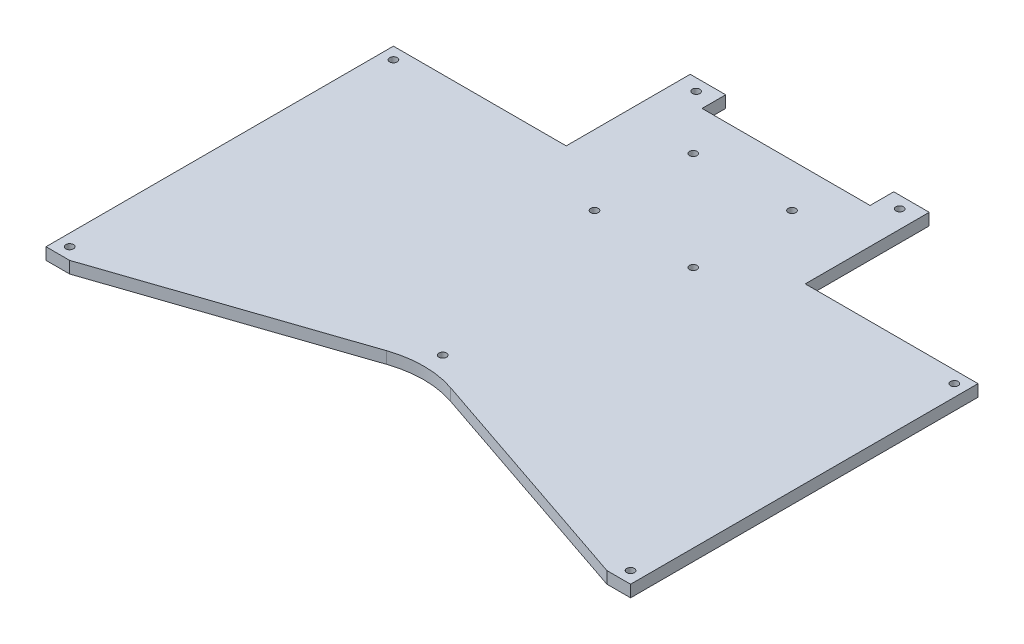
ISO-10303-21;
HEADER;
FILE_DESCRIPTION(('STEP AP214'),'2;1');
FILE_NAME('part.step','',(''),(''),'','','');
FILE_SCHEMA(('AUTOMOTIVE_DESIGN { 1 0 10303 214 1 1 1 1 }'));
ENDSEC;
DATA;
#1=APPLICATION_CONTEXT('core data for automotive mechanical design processes');
#2=APPLICATION_PROTOCOL_DEFINITION('international standard','automotive_design',2000,#1);
#3=PRODUCT_CONTEXT('',#1,'mechanical');
#4=PRODUCT('Part','Part','',(#3));
#5=PRODUCT_RELATED_PRODUCT_CATEGORY('part','',(#4));
#6=PRODUCT_DEFINITION_FORMATION('','',#4);
#7=PRODUCT_DEFINITION_CONTEXT('part definition',#1,'design');
#8=PRODUCT_DEFINITION('design','',#6,#7);
#9=PRODUCT_DEFINITION_SHAPE('','',#8);
#10=(LENGTH_UNIT() NAMED_UNIT(*) SI_UNIT(.MILLI.,.METRE.));
#11=(NAMED_UNIT(*) PLANE_ANGLE_UNIT() SI_UNIT($,.RADIAN.));
#12=(NAMED_UNIT(*) SI_UNIT($,.STERADIAN.) SOLID_ANGLE_UNIT());
#13=UNCERTAINTY_MEASURE_WITH_UNIT(LENGTH_MEASURE(1.E-05),#10,'distance_accuracy_value','');
#14=(GEOMETRIC_REPRESENTATION_CONTEXT(3) GLOBAL_UNCERTAINTY_ASSIGNED_CONTEXT((#13)) GLOBAL_UNIT_ASSIGNED_CONTEXT((#10,
#11,#12)) REPRESENTATION_CONTEXT('',''));
#15=CARTESIAN_POINT('',(0.,0.,0.));
#16=DIRECTION('',(0.,0.,1.));
#17=DIRECTION('',(1.,0.,0.));
#18=AXIS2_PLACEMENT_3D('',#15,#16,#17);
#19=CARTESIAN_POINT('',(35.5,5.,-21.2));
#20=DIRECTION('',(1.,0.,0.));
#21=DIRECTION('',(0.,0.,-1.));
#22=AXIS2_PLACEMENT_3D('',#19,#20,#21);
#23=PLANE('',#22);
#24=DIRECTION('',(0.,0.,1.));
#25=VECTOR('',#24,1.);
#26=CARTESIAN_POINT('',(35.5,0.,-21.2));
#27=LINE('',#26,#25);
#28=CARTESIAN_POINT('',(35.5,0.,-31.2));
#29=VERTEX_POINT('',#28);
#30=CARTESIAN_POINT('',(35.5,0.,-21.2));
#31=VERTEX_POINT('',#30);
#32=EDGE_CURVE('E177',#29,#31,#27,.T.);
#33=ORIENTED_EDGE('',*,*,#32,.T.);
#34=DIRECTION('',(0.,-1.,0.));
#35=VECTOR('',#34,1.);
#36=CARTESIAN_POINT('',(35.5,5.,-21.2));
#37=LINE('',#36,#35);
#38=CARTESIAN_POINT('',(35.5,5.,-21.2));
#39=VERTEX_POINT('',#38);
#40=EDGE_CURVE('E11',#39,#31,#37,.T.);
#41=ORIENTED_EDGE('',*,*,#40,.F.);
#42=DIRECTION('',(0.,0.,1.));
#43=VECTOR('',#42,1.);
#44=CARTESIAN_POINT('',(35.5,5.,-21.2));
#45=LINE('',#44,#43);
#46=CARTESIAN_POINT('',(35.5,5.,-31.2));
#47=VERTEX_POINT('',#46);
#48=EDGE_CURVE('E208',#47,#39,#45,.T.);
#49=ORIENTED_EDGE('',*,*,#48,.F.);
#50=DIRECTION('',(0.,-1.,0.));
#51=VECTOR('',#50,1.);
#52=CARTESIAN_POINT('',(35.5,5.,-31.2));
#53=LINE('',#52,#51);
#54=EDGE_CURVE('E173',#47,#29,#53,.T.);
#55=ORIENTED_EDGE('',*,*,#54,.T.);
#56=EDGE_LOOP('',(#33,#41,#49,#55));
#57=FACE_BOUND('',#56,.T.);
#58=ADVANCED_FACE('F33',(#57),#23,.F.);
#59=CARTESIAN_POINT('',(-35.5,5.,-21.2));
#60=DIRECTION('',(0.,0.,1.));
#61=DIRECTION('',(1.,0.,0.));
#62=AXIS2_PLACEMENT_3D('',#59,#60,#61);
#63=PLANE('',#62);
#64=DIRECTION('',(-1.,0.,0.));
#65=VECTOR('',#64,1.);
#66=CARTESIAN_POINT('',(-35.5,0.,-21.2));
#67=LINE('',#66,#65);
#68=CARTESIAN_POINT('',(-35.5,0.,-21.2));
#69=VERTEX_POINT('',#68);
#70=EDGE_CURVE('E180',#31,#69,#67,.T.);
#71=ORIENTED_EDGE('',*,*,#70,.T.);
#72=DIRECTION('',(0.,-1.,0.));
#73=VECTOR('',#72,1.);
#74=CARTESIAN_POINT('',(-35.5,5.,-21.2));
#75=LINE('',#74,#73);
#76=CARTESIAN_POINT('',(-35.5,5.,-21.2));
#77=VERTEX_POINT('',#76);
#78=EDGE_CURVE('E41',#77,#69,#75,.T.);
#79=ORIENTED_EDGE('',*,*,#78,.F.);
#80=DIRECTION('',(-1.,0.,0.));
#81=VECTOR('',#80,1.);
#82=CARTESIAN_POINT('',(-35.5,5.,-21.2));
#83=LINE('',#82,#81);
#84=EDGE_CURVE('E116',#39,#77,#83,.T.);
#85=ORIENTED_EDGE('',*,*,#84,.F.);
#86=ORIENTED_EDGE('',*,*,#40,.T.);
#87=EDGE_LOOP('',(#71,#79,#85,#86));
#88=FACE_BOUND('',#87,.T.);
#89=ADVANCED_FACE('F307',(#88),#63,.F.);
#90=CARTESIAN_POINT('',(-35.5,5.,-31.2));
#91=DIRECTION('',(-1.,0.,0.));
#92=DIRECTION('',(0.,0.,1.));
#93=AXIS2_PLACEMENT_3D('',#90,#91,#92);
#94=PLANE('',#93);
#95=DIRECTION('',(0.,0.,-1.));
#96=VECTOR('',#95,1.);
#97=CARTESIAN_POINT('',(-35.5,0.,-31.2));
#98=LINE('',#97,#96);
#99=CARTESIAN_POINT('',(-35.5,0.,-31.2));
#100=VERTEX_POINT('',#99);
#101=EDGE_CURVE('E183',#69,#100,#98,.T.);
#102=ORIENTED_EDGE('',*,*,#101,.T.);
#103=DIRECTION('',(0.,-1.,0.));
#104=VECTOR('',#103,1.);
#105=CARTESIAN_POINT('',(-35.5,5.,-31.2));
#106=LINE('',#105,#104);
#107=CARTESIAN_POINT('',(-35.5,5.,-31.2));
#108=VERTEX_POINT('',#107);
#109=EDGE_CURVE('E239',#108,#100,#106,.T.);
#110=ORIENTED_EDGE('',*,*,#109,.F.);
#111=DIRECTION('',(0.,0.,-1.));
#112=VECTOR('',#111,1.);
#113=CARTESIAN_POINT('',(-35.5,5.,-31.2));
#114=LINE('',#113,#112);
#115=EDGE_CURVE('E247',#77,#108,#114,.T.);
#116=ORIENTED_EDGE('',*,*,#115,.F.);
#117=ORIENTED_EDGE('',*,*,#78,.T.);
#118=EDGE_LOOP('',(#102,#110,#116,#117));
#119=FACE_BOUND('',#118,.T.);
#120=ADVANCED_FACE('F245',(#119),#94,.F.);
#121=CARTESIAN_POINT('',(-50.5,5.,-31.2));
#122=DIRECTION('',(0.,0.,1.));
#123=DIRECTION('',(1.,0.,0.));
#124=AXIS2_PLACEMENT_3D('',#121,#122,#123);
#125=PLANE('',#124);
#126=DIRECTION('',(-1.,0.,0.));
#127=VECTOR('',#126,1.);
#128=CARTESIAN_POINT('',(-50.5,0.,-31.2));
#129=LINE('',#128,#127);
#130=CARTESIAN_POINT('',(-50.5,0.,-31.2));
#131=VERTEX_POINT('',#130);
#132=EDGE_CURVE('E185',#100,#131,#129,.T.);
#133=ORIENTED_EDGE('',*,*,#132,.T.);
#134=DIRECTION('',(0.,-1.,0.));
#135=VECTOR('',#134,1.);
#136=CARTESIAN_POINT('',(-50.5,5.,-31.2));
#137=LINE('',#136,#135);
#138=CARTESIAN_POINT('',(-50.5,5.,-31.2));
#139=VERTEX_POINT('',#138);
#140=EDGE_CURVE('E236',#139,#131,#137,.T.);
#141=ORIENTED_EDGE('',*,*,#140,.F.);
#142=DIRECTION('',(-1.,0.,0.));
#143=VECTOR('',#142,1.);
#144=CARTESIAN_POINT('',(-50.5,5.,-31.2));
#145=LINE('',#144,#143);
#146=EDGE_CURVE('E265',#108,#139,#145,.T.);
#147=ORIENTED_EDGE('',*,*,#146,.F.);
#148=ORIENTED_EDGE('',*,*,#109,.T.);
#149=EDGE_LOOP('',(#133,#141,#147,#148));
#150=FACE_BOUND('',#149,.T.);
#151=ADVANCED_FACE('F256',(#150),#125,.F.);
#152=CARTESIAN_POINT('',(-50.5,5.,21.2));
#153=DIRECTION('',(1.,0.,0.));
#154=DIRECTION('',(0.,0.,-1.));
#155=AXIS2_PLACEMENT_3D('',#152,#153,#154);
#156=PLANE('',#155);
#157=DIRECTION('',(0.,0.,1.));
#158=VECTOR('',#157,1.);
#159=CARTESIAN_POINT('',(-50.5,0.,21.2));
#160=LINE('',#159,#158);
#161=CARTESIAN_POINT('',(-50.5,0.,21.2));
#162=VERTEX_POINT('',#161);
#163=EDGE_CURVE('E187',#131,#162,#160,.T.);
#164=ORIENTED_EDGE('',*,*,#163,.T.);
#165=DIRECTION('',(0.,-1.,0.));
#166=VECTOR('',#165,1.);
#167=CARTESIAN_POINT('',(-50.5,5.,21.2));
#168=LINE('',#167,#166);
#169=CARTESIAN_POINT('',(-50.5,5.,21.2));
#170=VERTEX_POINT('',#169);
#171=EDGE_CURVE('E233',#170,#162,#168,.T.);
#172=ORIENTED_EDGE('',*,*,#171,.F.);
#173=DIRECTION('',(0.,0.,1.));
#174=VECTOR('',#173,1.);
#175=CARTESIAN_POINT('',(-50.5,5.,21.2));
#176=LINE('',#175,#174);
#177=EDGE_CURVE('E262',#139,#170,#176,.T.);
#178=ORIENTED_EDGE('',*,*,#177,.F.);
#179=ORIENTED_EDGE('',*,*,#140,.T.);
#180=EDGE_LOOP('',(#164,#172,#178,#179));
#181=FACE_BOUND('',#180,.T.);
#182=ADVANCED_FACE('F260',(#181),#156,.F.);
#183=CARTESIAN_POINT('',(-123.5,5.,21.2));
#184=DIRECTION('',(0.,0.,1.));
#185=DIRECTION('',(1.,0.,0.));
#186=AXIS2_PLACEMENT_3D('',#183,#184,#185);
#187=PLANE('',#186);
#188=DIRECTION('',(-1.,0.,0.));
#189=VECTOR('',#188,1.);
#190=CARTESIAN_POINT('',(-123.5,0.,21.2));
#191=LINE('',#190,#189);
#192=CARTESIAN_POINT('',(-123.5,0.,21.2));
#193=VERTEX_POINT('',#192);
#194=EDGE_CURVE('E189',#162,#193,#191,.T.);
#195=ORIENTED_EDGE('',*,*,#194,.T.);
#196=DIRECTION('',(0.,-1.,0.));
#197=VECTOR('',#196,1.);
#198=CARTESIAN_POINT('',(-123.5,5.,21.2));
#199=LINE('',#198,#197);
#200=CARTESIAN_POINT('',(-123.5,5.,21.2));
#201=VERTEX_POINT('',#200);
#202=EDGE_CURVE('E230',#201,#193,#199,.T.);
#203=ORIENTED_EDGE('',*,*,#202,.F.);
#204=DIRECTION('',(-1.,0.,0.));
#205=VECTOR('',#204,1.);
#206=CARTESIAN_POINT('',(-123.5,5.,21.2));
#207=LINE('',#206,#205);
#208=EDGE_CURVE('E264',#170,#201,#207,.T.);
#209=ORIENTED_EDGE('',*,*,#208,.F.);
#210=ORIENTED_EDGE('',*,*,#171,.T.);
#211=EDGE_LOOP('',(#195,#203,#209,#210));
#212=FACE_BOUND('',#211,.T.);
#213=ADVANCED_FACE('F320',(#212),#187,.F.);
#214=CARTESIAN_POINT('',(-123.5,5.,168.));
#215=DIRECTION('',(1.,0.,0.));
#216=DIRECTION('',(0.,0.,-1.));
#217=AXIS2_PLACEMENT_3D('',#214,#215,#216);
#218=PLANE('',#217);
#219=DIRECTION('',(0.,0.,1.));
#220=VECTOR('',#219,1.);
#221=CARTESIAN_POINT('',(-123.5,0.,168.));
#222=LINE('',#221,#220);
#223=CARTESIAN_POINT('',(-123.5,0.,168.));
#224=VERTEX_POINT('',#223);
#225=EDGE_CURVE('E191',#193,#224,#222,.T.);
#226=ORIENTED_EDGE('',*,*,#225,.T.);
#227=DIRECTION('',(0.,-1.,0.));
#228=VECTOR('',#227,1.);
#229=CARTESIAN_POINT('',(-123.5,5.,168.));
#230=LINE('',#229,#228);
#231=CARTESIAN_POINT('',(-123.5,5.,168.));
#232=VERTEX_POINT('',#231);
#233=EDGE_CURVE('E227',#232,#224,#230,.T.);
#234=ORIENTED_EDGE('',*,*,#233,.F.);
#235=DIRECTION('',(0.,0.,1.));
#236=VECTOR('',#235,1.);
#237=CARTESIAN_POINT('',(-123.5,5.,168.));
#238=LINE('',#237,#236);
#239=EDGE_CURVE('E267',#201,#232,#238,.T.);
#240=ORIENTED_EDGE('',*,*,#239,.F.);
#241=ORIENTED_EDGE('',*,*,#202,.T.);
#242=EDGE_LOOP('',(#226,#234,#240,#241));
#243=FACE_BOUND('',#242,.T.);
#244=ADVANCED_FACE('F323',(#243),#218,.F.);
#245=CARTESIAN_POINT('',(-113.5,5.,168.));
#246=DIRECTION('',(0.,0.,-1.));
#247=DIRECTION('',(-1.,0.,0.));
#248=AXIS2_PLACEMENT_3D('',#245,#246,#247);
#249=PLANE('',#248);
#250=DIRECTION('',(1.,0.,0.));
#251=VECTOR('',#250,1.);
#252=CARTESIAN_POINT('',(-113.5,0.,168.));
#253=LINE('',#252,#251);
#254=CARTESIAN_POINT('',(-113.5,0.,168.));
#255=VERTEX_POINT('',#254);
#256=EDGE_CURVE('E193',#224,#255,#253,.T.);
#257=ORIENTED_EDGE('',*,*,#256,.T.);
#258=DIRECTION('',(0.,-1.,0.));
#259=VECTOR('',#258,1.);
#260=CARTESIAN_POINT('',(-113.5,5.,168.));
#261=LINE('',#260,#259);
#262=CARTESIAN_POINT('',(-113.5,5.,168.));
#263=VERTEX_POINT('',#262);
#264=EDGE_CURVE('E224',#263,#255,#261,.T.);
#265=ORIENTED_EDGE('',*,*,#264,.F.);
#266=DIRECTION('',(1.,0.,0.));
#267=VECTOR('',#266,1.);
#268=CARTESIAN_POINT('',(-113.5,5.,168.));
#269=LINE('',#268,#267);
#270=EDGE_CURVE('E273',#232,#263,#269,.T.);
#271=ORIENTED_EDGE('',*,*,#270,.F.);
#272=ORIENTED_EDGE('',*,*,#233,.T.);
#273=EDGE_LOOP('',(#257,#265,#271,#272));
#274=FACE_BOUND('',#273,.T.);
#275=ADVANCED_FACE('F327',(#274),#249,.F.);
#276=CARTESIAN_POINT('',(-113.5,5.,168.));
#277=DIRECTION('',(-0.321149003928869,0.,-0.947028678169513));
#278=DIRECTION('',(-0.947028678169513,0.,0.321149003928869));
#279=AXIS2_PLACEMENT_3D('',#276,#277,#278);
#280=PLANE('',#279);
#281=DIRECTION('',(0.947028678169513,0.,-0.321149003928869));
#282=VECTOR('',#281,1.);
#283=CARTESIAN_POINT('',(-113.5,0.,168.));
#284=LINE('',#283,#282);
#285=CARTESIAN_POINT('',(-13.4882581650125,0.,134.08479551688));
#286=VERTEX_POINT('',#285);
#287=EDGE_CURVE('E195',#255,#286,#284,.T.);
#288=ORIENTED_EDGE('',*,*,#287,.T.);
#289=DIRECTION('',(0.,-1.,0.));
#290=VECTOR('',#289,1.);
#291=CARTESIAN_POINT('',(-13.4882581650125,5.,134.08479551688));
#292=LINE('',#291,#290);
#293=CARTESIAN_POINT('',(-13.4882581650125,5.,134.08479551688));
#294=VERTEX_POINT('',#293);
#295=EDGE_CURVE('E221',#294,#286,#292,.T.);
#296=ORIENTED_EDGE('',*,*,#295,.F.);
#297=DIRECTION('',(0.947028678169513,0.,-0.321149003928869));
#298=VECTOR('',#297,1.);
#299=CARTESIAN_POINT('',(-113.5,5.,168.));
#300=LINE('',#299,#298);
#301=EDGE_CURVE('E275',#263,#294,#300,.T.);
#302=ORIENTED_EDGE('',*,*,#301,.F.);
#303=ORIENTED_EDGE('',*,*,#264,.T.);
#304=EDGE_LOOP('',(#288,#296,#302,#303));
#305=FACE_BOUND('',#304,.T.);
#306=ADVANCED_FACE('F331',(#305),#280,.F.);
#307=CARTESIAN_POINT('',(0.,5.,173.86));
#308=DIRECTION('',(0.,-1.,0.));
#309=DIRECTION('',(0.,0.,-1.));
#310=AXIS2_PLACEMENT_3D('',#307,#308,#309);
#311=CYLINDRICAL_SURFACE('',#310,42.);
#312=CARTESIAN_POINT('',(0.,0.,173.86));
#313=DIRECTION('',(0.,-1.,0.));
#314=DIRECTION('',(0.,0.,-1.));
#315=AXIS2_PLACEMENT_3D('',#312,#313,#314);
#316=CIRCLE('',#315,42.);
#317=CARTESIAN_POINT('',(13.4882581650125,0.,134.08479551688));
#318=VERTEX_POINT('',#317);
#319=EDGE_CURVE('E197',#286,#318,#316,.T.);
#320=ORIENTED_EDGE('',*,*,#319,.T.);
#321=DIRECTION('',(0.,-1.,0.));
#322=VECTOR('',#321,1.);
#323=CARTESIAN_POINT('',(13.4882581650125,5.,134.08479551688));
#324=LINE('',#323,#322);
#325=CARTESIAN_POINT('',(13.4882581650125,5.,134.08479551688));
#326=VERTEX_POINT('',#325);
#327=EDGE_CURVE('E218',#326,#318,#324,.T.);
#328=ORIENTED_EDGE('',*,*,#327,.F.);
#329=CARTESIAN_POINT('',(0.,5.,173.86));
#330=DIRECTION('',(0.,-1.,0.));
#331=DIRECTION('',(0.,0.,-1.));
#332=AXIS2_PLACEMENT_3D('',#329,#330,#331);
#333=CIRCLE('',#332,42.);
#334=EDGE_CURVE('E277',#294,#326,#333,.T.);
#335=ORIENTED_EDGE('',*,*,#334,.F.);
#336=ORIENTED_EDGE('',*,*,#295,.T.);
#337=EDGE_LOOP('',(#320,#328,#335,#336));
#338=FACE_BOUND('',#337,.T.);
#339=ADVANCED_FACE('F335',(#338),#311,.F.);
#340=CARTESIAN_POINT('',(13.4882581650125,5.,134.08479551688));
#341=DIRECTION('',(0.32114900392887,0.,-0.947028678169513));
#342=DIRECTION('',(-0.947028678169513,0.,-0.32114900392887));
#343=AXIS2_PLACEMENT_3D('',#340,#341,#342);
#344=PLANE('',#343);
#345=DIRECTION('',(0.947028678169513,0.,0.32114900392887));
#346=VECTOR('',#345,1.);
#347=CARTESIAN_POINT('',(13.4882581650125,0.,134.08479551688));
#348=LINE('',#347,#346);
#349=CARTESIAN_POINT('',(113.5,0.,168.));
#350=VERTEX_POINT('',#349);
#351=EDGE_CURVE('E199',#318,#350,#348,.T.);
#352=ORIENTED_EDGE('',*,*,#351,.T.);
#353=DIRECTION('',(0.,-1.,0.));
#354=VECTOR('',#353,1.);
#355=CARTESIAN_POINT('',(113.5,5.,168.));
#356=LINE('',#355,#354);
#357=CARTESIAN_POINT('',(113.5,5.,168.));
#358=VERTEX_POINT('',#357);
#359=EDGE_CURVE('E215',#358,#350,#356,.T.);
#360=ORIENTED_EDGE('',*,*,#359,.F.);
#361=DIRECTION('',(0.947028678169513,0.,0.32114900392887));
#362=VECTOR('',#361,1.);
#363=CARTESIAN_POINT('',(13.4882581650125,5.,134.08479551688));
#364=LINE('',#363,#362);
#365=EDGE_CURVE('E279',#326,#358,#364,.T.);
#366=ORIENTED_EDGE('',*,*,#365,.F.);
#367=ORIENTED_EDGE('',*,*,#327,.T.);
#368=EDGE_LOOP('',(#352,#360,#366,#367));
#369=FACE_BOUND('',#368,.T.);
#370=ADVANCED_FACE('F339',(#369),#344,.F.);
#371=CARTESIAN_POINT('',(123.5,5.,168.));
#372=DIRECTION('',(0.,0.,-1.));
#373=DIRECTION('',(-1.,0.,0.));
#374=AXIS2_PLACEMENT_3D('',#371,#372,#373);
#375=PLANE('',#374);
#376=DIRECTION('',(1.,0.,0.));
#377=VECTOR('',#376,1.);
#378=CARTESIAN_POINT('',(123.5,0.,168.));
#379=LINE('',#378,#377);
#380=CARTESIAN_POINT('',(123.5,0.,168.));
#381=VERTEX_POINT('',#380);
#382=EDGE_CURVE('E201',#350,#381,#379,.T.);
#383=ORIENTED_EDGE('',*,*,#382,.T.);
#384=DIRECTION('',(0.,-1.,0.));
#385=VECTOR('',#384,1.);
#386=CARTESIAN_POINT('',(123.5,5.,168.));
#387=LINE('',#386,#385);
#388=CARTESIAN_POINT('',(123.5,5.,168.));
#389=VERTEX_POINT('',#388);
#390=EDGE_CURVE('E212',#389,#381,#387,.T.);
#391=ORIENTED_EDGE('',*,*,#390,.F.);
#392=DIRECTION('',(1.,0.,0.));
#393=VECTOR('',#392,1.);
#394=CARTESIAN_POINT('',(123.5,5.,168.));
#395=LINE('',#394,#393);
#396=EDGE_CURVE('E281',#358,#389,#395,.T.);
#397=ORIENTED_EDGE('',*,*,#396,.F.);
#398=ORIENTED_EDGE('',*,*,#359,.T.);
#399=EDGE_LOOP('',(#383,#391,#397,#398));
#400=FACE_BOUND('',#399,.T.);
#401=ADVANCED_FACE('F287',(#400),#375,.F.);
#402=CARTESIAN_POINT('',(123.5,5.,21.2000000000035));
#403=DIRECTION('',(-1.,0.,0.));
#404=DIRECTION('',(0.,0.,1.));
#405=AXIS2_PLACEMENT_3D('',#402,#403,#404);
#406=PLANE('',#405);
#407=DIRECTION('',(0.,0.,-1.));
#408=VECTOR('',#407,1.);
#409=CARTESIAN_POINT('',(123.5,0.,21.2000000000035));
#410=LINE('',#409,#408);
#411=CARTESIAN_POINT('',(123.5,0.,21.2000000000035));
#412=VERTEX_POINT('',#411);
#413=EDGE_CURVE('E203',#381,#412,#410,.T.);
#414=ORIENTED_EDGE('',*,*,#413,.T.);
#415=DIRECTION('',(0.,-1.,0.));
#416=VECTOR('',#415,1.);
#417=CARTESIAN_POINT('',(123.5,5.,21.2000000000035));
#418=LINE('',#417,#416);
#419=CARTESIAN_POINT('',(123.5,5.,21.2000000000035));
#420=VERTEX_POINT('',#419);
#421=EDGE_CURVE('E168',#420,#412,#418,.T.);
#422=ORIENTED_EDGE('',*,*,#421,.F.);
#423=DIRECTION('',(0.,0.,-1.));
#424=VECTOR('',#423,1.);
#425=CARTESIAN_POINT('',(123.5,5.,21.2000000000035));
#426=LINE('',#425,#424);
#427=EDGE_CURVE('E159',#389,#420,#426,.T.);
#428=ORIENTED_EDGE('',*,*,#427,.F.);
#429=ORIENTED_EDGE('',*,*,#390,.T.);
#430=EDGE_LOOP('',(#414,#422,#428,#429));
#431=FACE_BOUND('',#430,.T.);
#432=ADVANCED_FACE('F291',(#431),#406,.F.);
#433=CARTESIAN_POINT('',(123.5,5.,21.2000000000035));
#434=DIRECTION('',(0.,0.,1.));
#435=DIRECTION('',(1.,0.,0.));
#436=AXIS2_PLACEMENT_3D('',#433,#434,#435);
#437=PLANE('',#436);
#438=DIRECTION('',(-1.,0.,0.));
#439=VECTOR('',#438,1.);
#440=CARTESIAN_POINT('',(123.5,0.,21.2000000000035));
#441=LINE('',#440,#439);
#442=CARTESIAN_POINT('',(50.5,0.,21.2));
#443=VERTEX_POINT('',#442);
#444=EDGE_CURVE('E167',#412,#443,#441,.T.);
#445=ORIENTED_EDGE('',*,*,#444,.T.);
#446=DIRECTION('',(0.,-1.,0.));
#447=VECTOR('',#446,1.);
#448=CARTESIAN_POINT('',(50.5,5.,21.2));
#449=LINE('',#448,#447);
#450=CARTESIAN_POINT('',(50.5,5.,21.2));
#451=VERTEX_POINT('',#450);
#452=EDGE_CURVE('E164',#451,#443,#449,.T.);
#453=ORIENTED_EDGE('',*,*,#452,.F.);
#454=DIRECTION('',(-1.,0.,0.));
#455=VECTOR('',#454,1.);
#456=CARTESIAN_POINT('',(123.5,5.,21.2000000000035));
#457=LINE('',#456,#455);
#458=EDGE_CURVE('E153',#420,#451,#457,.T.);
#459=ORIENTED_EDGE('',*,*,#458,.F.);
#460=ORIENTED_EDGE('',*,*,#421,.T.);
#461=EDGE_LOOP('',(#445,#453,#459,#460));
#462=FACE_BOUND('',#461,.T.);
#463=ADVANCED_FACE('F165',(#462),#437,.F.);
#464=CARTESIAN_POINT('',(50.5,5.,21.2));
#465=DIRECTION('',(-1.,0.,0.));
#466=DIRECTION('',(0.,0.,1.));
#467=AXIS2_PLACEMENT_3D('',#464,#465,#466);
#468=PLANE('',#467);
#469=DIRECTION('',(0.,0.,-1.));
#470=VECTOR('',#469,1.);
#471=CARTESIAN_POINT('',(50.5,0.,21.2));
#472=LINE('',#471,#470);
#473=CARTESIAN_POINT('',(50.5,0.,-31.2));
#474=VERTEX_POINT('',#473);
#475=EDGE_CURVE('E102',#443,#474,#472,.T.);
#476=ORIENTED_EDGE('',*,*,#475,.T.);
#477=DIRECTION('',(0.,-1.,0.));
#478=VECTOR('',#477,1.);
#479=CARTESIAN_POINT('',(50.5,5.,-31.2));
#480=LINE('',#479,#478);
#481=CARTESIAN_POINT('',(50.5,5.,-31.2));
#482=VERTEX_POINT('',#481);
#483=EDGE_CURVE('E169',#482,#474,#480,.T.);
#484=ORIENTED_EDGE('',*,*,#483,.F.);
#485=DIRECTION('',(0.,0.,-1.));
#486=VECTOR('',#485,1.);
#487=CARTESIAN_POINT('',(50.5,5.,21.2));
#488=LINE('',#487,#486);
#489=EDGE_CURVE('E157',#451,#482,#488,.T.);
#490=ORIENTED_EDGE('',*,*,#489,.F.);
#491=ORIENTED_EDGE('',*,*,#452,.T.);
#492=EDGE_LOOP('',(#476,#484,#490,#491));
#493=FACE_BOUND('',#492,.T.);
#494=ADVANCED_FACE('F171',(#493),#468,.F.);
#495=CARTESIAN_POINT('',(35.5,5.,-31.2));
#496=DIRECTION('',(0.,0.,1.));
#497=DIRECTION('',(1.,0.,0.));
#498=AXIS2_PLACEMENT_3D('',#495,#496,#497);
#499=PLANE('',#498);
#500=DIRECTION('',(-1.,0.,0.));
#501=VECTOR('',#500,1.);
#502=CARTESIAN_POINT('',(35.5,0.,-31.2));
#503=LINE('',#502,#501);
#504=EDGE_CURVE('E108',#474,#29,#503,.T.);
#505=ORIENTED_EDGE('',*,*,#504,.T.);
#506=ORIENTED_EDGE('',*,*,#54,.F.);
#507=DIRECTION('',(-1.,0.,0.));
#508=VECTOR('',#507,1.);
#509=CARTESIAN_POINT('',(35.5,5.,-31.2));
#510=LINE('',#509,#508);
#511=EDGE_CURVE('E49',#482,#47,#510,.T.);
#512=ORIENTED_EDGE('',*,*,#511,.F.);
#513=ORIENTED_EDGE('',*,*,#483,.T.);
#514=EDGE_LOOP('',(#505,#506,#512,#513));
#515=FACE_BOUND('',#514,.T.);
#516=ADVANCED_FACE('F295',(#515),#499,.F.);
#517=CARTESIAN_POINT('',(0.,5.,173.86));
#518=DIRECTION('',(0.,-1.,0.));
#519=DIRECTION('',(0.,0.,-1.));
#520=AXIS2_PLACEMENT_3D('',#517,#518,#519);
#521=PLANE('',#520);
#522=CARTESIAN_POINT('',(-20.859650045,5.,38.859650045));
#523=DIRECTION('',(0.,-1.,0.));
#524=DIRECTION('',(0.,0.,-1.));
#525=AXIS2_PLACEMENT_3D('',#522,#523,#524);
#526=CIRCLE('',#525,1.60000000000001);
#527=CARTESIAN_POINT('',(-20.859650045,5.,37.259650045));
#528=VERTEX_POINT('',#527);
#529=EDGE_CURVE('E492',#528,#528,#526,.T.);
#530=ORIENTED_EDGE('',*,*,#529,.T.);
#531=EDGE_LOOP('',(#530));
#532=FACE_BOUND('',#531,.T.);
#533=CARTESIAN_POINT('',(20.859650045,5.,38.859650045));
#534=DIRECTION('',(0.,-1.,0.));
#535=DIRECTION('',(0.,0.,-1.));
#536=AXIS2_PLACEMENT_3D('',#533,#534,#535);
#537=CIRCLE('',#536,1.60000000000001);
#538=CARTESIAN_POINT('',(20.859650045,5.,37.259650045));
#539=VERTEX_POINT('',#538);
#540=EDGE_CURVE('E496',#539,#539,#537,.T.);
#541=ORIENTED_EDGE('',*,*,#540,.T.);
#542=EDGE_LOOP('',(#541));
#543=FACE_BOUND('',#542,.T.);
#544=CARTESIAN_POINT('',(-20.859650045,5.,-2.85965004500001));
#545=DIRECTION('',(0.,-1.,0.));
#546=DIRECTION('',(0.,0.,-1.));
#547=AXIS2_PLACEMENT_3D('',#544,#545,#546);
#548=CIRCLE('',#547,1.6);
#549=CARTESIAN_POINT('',(-20.859650045,5.,-4.45965004500001));
#550=VERTEX_POINT('',#549);
#551=EDGE_CURVE('E507',#550,#550,#548,.T.);
#552=ORIENTED_EDGE('',*,*,#551,.T.);
#553=EDGE_LOOP('',(#552));
#554=FACE_BOUND('',#553,.T.);
#555=CARTESIAN_POINT('',(20.859650045,5.,-2.85965004500001));
#556=DIRECTION('',(0.,-1.,0.));
#557=DIRECTION('',(0.,0.,-1.));
#558=AXIS2_PLACEMENT_3D('',#555,#556,#557);
#559=CIRCLE('',#558,1.6);
#560=CARTESIAN_POINT('',(20.859650045,5.,-4.45965004500001));
#561=VERTEX_POINT('',#560);
#562=EDGE_CURVE('E581',#561,#561,#559,.T.);
#563=ORIENTED_EDGE('',*,*,#562,.T.);
#564=EDGE_LOOP('',(#563));
#565=FACE_BOUND('',#564,.T.);
#566=CARTESIAN_POINT('',(0.,5.,123.86));
#567=DIRECTION('',(0.,-1.,0.));
#568=DIRECTION('',(0.,0.,-1.));
#569=AXIS2_PLACEMENT_3D('',#566,#567,#568);
#570=CIRCLE('',#569,1.6);
#571=CARTESIAN_POINT('',(0.,5.,122.26));
#572=VERTEX_POINT('',#571);
#573=EDGE_CURVE('E589',#572,#572,#570,.T.);
#574=ORIENTED_EDGE('',*,*,#573,.T.);
#575=EDGE_LOOP('',(#574));
#576=FACE_BOUND('',#575,.T.);
#577=CARTESIAN_POINT('',(-43.,5.,-26.2));
#578=DIRECTION('',(0.,-1.,0.));
#579=DIRECTION('',(0.,0.,-1.));
#580=AXIS2_PLACEMENT_3D('',#577,#578,#579);
#581=CIRCLE('',#580,1.6);
#582=CARTESIAN_POINT('',(-43.,5.,-27.8));
#583=VERTEX_POINT('',#582);
#584=EDGE_CURVE('E533',#583,#583,#581,.T.);
#585=ORIENTED_EDGE('',*,*,#584,.T.);
#586=EDGE_LOOP('',(#585));
#587=FACE_BOUND('',#586,.T.);
#588=CARTESIAN_POINT('',(43.,5.,-26.2));
#589=DIRECTION('',(0.,-1.,0.));
#590=DIRECTION('',(0.,0.,-1.));
#591=AXIS2_PLACEMENT_3D('',#588,#589,#590);
#592=CIRCLE('',#591,1.6);
#593=CARTESIAN_POINT('',(43.,5.,-27.8));
#594=VERTEX_POINT('',#593);
#595=EDGE_CURVE('E527',#594,#594,#592,.T.);
#596=ORIENTED_EDGE('',*,*,#595,.T.);
#597=EDGE_LOOP('',(#596));
#598=FACE_BOUND('',#597,.T.);
#599=CARTESIAN_POINT('',(-118.5,5.,26.2));
#600=DIRECTION('',(0.,-1.,0.));
#601=DIRECTION('',(0.,0.,-1.));
#602=AXIS2_PLACEMENT_3D('',#599,#600,#601);
#603=CIRCLE('',#602,1.6);
#604=CARTESIAN_POINT('',(-118.5,5.,24.6));
#605=VERTEX_POINT('',#604);
#606=EDGE_CURVE('E521',#605,#605,#603,.T.);
#607=ORIENTED_EDGE('',*,*,#606,.T.);
#608=EDGE_LOOP('',(#607));
#609=FACE_BOUND('',#608,.T.);
#610=CARTESIAN_POINT('',(118.5,5.,26.2000000000035));
#611=DIRECTION('',(0.,-1.,0.));
#612=DIRECTION('',(0.,0.,-1.));
#613=AXIS2_PLACEMENT_3D('',#610,#611,#612);
#614=CIRCLE('',#613,1.6);
#615=CARTESIAN_POINT('',(118.5,5.,24.6000000000035));
#616=VERTEX_POINT('',#615);
#617=EDGE_CURVE('E515',#616,#616,#614,.T.);
#618=ORIENTED_EDGE('',*,*,#617,.T.);
#619=EDGE_LOOP('',(#618));
#620=FACE_BOUND('',#619,.T.);
#621=CARTESIAN_POINT('',(118.5,5.,163.));
#622=DIRECTION('',(0.,-1.,0.));
#623=DIRECTION('',(0.,0.,-1.));
#624=AXIS2_PLACEMENT_3D('',#621,#622,#623);
#625=CIRCLE('',#624,1.6);
#626=CARTESIAN_POINT('',(118.5,5.,161.4));
#627=VERTEX_POINT('',#626);
#628=EDGE_CURVE('E508',#627,#627,#625,.T.);
#629=ORIENTED_EDGE('',*,*,#628,.T.);
#630=EDGE_LOOP('',(#629));
#631=FACE_BOUND('',#630,.T.);
#632=CARTESIAN_POINT('',(-118.5,5.,163.));
#633=DIRECTION('',(0.,-1.,0.));
#634=DIRECTION('',(0.,0.,-1.));
#635=AXIS2_PLACEMENT_3D('',#632,#633,#634);
#636=CIRCLE('',#635,1.6);
#637=CARTESIAN_POINT('',(-118.5,5.,161.4));
#638=VERTEX_POINT('',#637);
#639=EDGE_CURVE('E181',#638,#638,#636,.T.);
#640=ORIENTED_EDGE('',*,*,#639,.T.);
#641=EDGE_LOOP('',(#640));
#642=FACE_BOUND('',#641,.T.);
#643=ORIENTED_EDGE('',*,*,#48,.T.);
#644=ORIENTED_EDGE('',*,*,#84,.T.);
#645=ORIENTED_EDGE('',*,*,#115,.T.);
#646=ORIENTED_EDGE('',*,*,#146,.T.);
#647=ORIENTED_EDGE('',*,*,#177,.T.);
#648=ORIENTED_EDGE('',*,*,#208,.T.);
#649=ORIENTED_EDGE('',*,*,#239,.T.);
#650=ORIENTED_EDGE('',*,*,#270,.T.);
#651=ORIENTED_EDGE('',*,*,#301,.T.);
#652=ORIENTED_EDGE('',*,*,#334,.T.);
#653=ORIENTED_EDGE('',*,*,#365,.T.);
#654=ORIENTED_EDGE('',*,*,#396,.T.);
#655=ORIENTED_EDGE('',*,*,#427,.T.);
#656=ORIENTED_EDGE('',*,*,#458,.T.);
#657=ORIENTED_EDGE('',*,*,#489,.T.);
#658=ORIENTED_EDGE('',*,*,#511,.T.);
#659=EDGE_LOOP('',(#643,#644,#645,#646,#647,#648,#649,#650,#651,#652,#653,#654,#655,#656,#657,#658));
#660=FACE_BOUND('',#659,.T.);
#661=ADVANCED_FACE('F155',(#532,#543,#554,#565,#576,#587,#598,#609,#620,#631,#642,#660),#521,.F.);
#662=CARTESIAN_POINT('',(0.,0.,173.86));
#663=DIRECTION('',(0.,-1.,0.));
#664=DIRECTION('',(0.,0.,-1.));
#665=AXIS2_PLACEMENT_3D('',#662,#663,#664);
#666=PLANE('',#665);
#667=CARTESIAN_POINT('',(-20.859650045,0.,38.859650045));
#668=DIRECTION('',(0.,-1.,0.));
#669=DIRECTION('',(0.,0.,-1.));
#670=AXIS2_PLACEMENT_3D('',#667,#668,#669);
#671=CIRCLE('',#670,1.60000000000001);
#672=CARTESIAN_POINT('',(-20.859650045,0.,37.259650045));
#673=VERTEX_POINT('',#672);
#674=EDGE_CURVE('E495',#673,#673,#671,.T.);
#675=ORIENTED_EDGE('',*,*,#674,.F.);
#676=EDGE_LOOP('',(#675));
#677=FACE_BOUND('',#676,.T.);
#678=CARTESIAN_POINT('',(20.859650045,0.,38.859650045));
#679=DIRECTION('',(0.,-1.,0.));
#680=DIRECTION('',(0.,0.,-1.));
#681=AXIS2_PLACEMENT_3D('',#678,#679,#680);
#682=CIRCLE('',#681,1.60000000000001);
#683=CARTESIAN_POINT('',(20.859650045,0.,37.259650045));
#684=VERTEX_POINT('',#683);
#685=EDGE_CURVE('E501',#684,#684,#682,.T.);
#686=ORIENTED_EDGE('',*,*,#685,.F.);
#687=EDGE_LOOP('',(#686));
#688=FACE_BOUND('',#687,.T.);
#689=CARTESIAN_POINT('',(-20.859650045,0.,-2.85965004500001));
#690=DIRECTION('',(0.,-1.,0.));
#691=DIRECTION('',(0.,0.,-1.));
#692=AXIS2_PLACEMENT_3D('',#689,#690,#691);
#693=CIRCLE('',#692,1.6);
#694=CARTESIAN_POINT('',(-20.859650045,0.,-4.45965004500001));
#695=VERTEX_POINT('',#694);
#696=EDGE_CURVE('E576',#695,#695,#693,.T.);
#697=ORIENTED_EDGE('',*,*,#696,.F.);
#698=EDGE_LOOP('',(#697));
#699=FACE_BOUND('',#698,.T.);
#700=CARTESIAN_POINT('',(20.859650045,0.,-2.85965004500001));
#701=DIRECTION('',(0.,-1.,0.));
#702=DIRECTION('',(0.,0.,-1.));
#703=AXIS2_PLACEMENT_3D('',#700,#701,#702);
#704=CIRCLE('',#703,1.6);
#705=CARTESIAN_POINT('',(20.859650045,0.,-4.45965004500001));
#706=VERTEX_POINT('',#705);
#707=EDGE_CURVE('E586',#706,#706,#704,.T.);
#708=ORIENTED_EDGE('',*,*,#707,.F.);
#709=EDGE_LOOP('',(#708));
#710=FACE_BOUND('',#709,.T.);
#711=CARTESIAN_POINT('',(0.,0.,123.86));
#712=DIRECTION('',(0.,-1.,0.));
#713=DIRECTION('',(0.,0.,-1.));
#714=AXIS2_PLACEMENT_3D('',#711,#712,#713);
#715=CIRCLE('',#714,1.6);
#716=CARTESIAN_POINT('',(0.,0.,122.26));
#717=VERTEX_POINT('',#716);
#718=EDGE_CURVE('E591',#717,#717,#715,.T.);
#719=ORIENTED_EDGE('',*,*,#718,.F.);
#720=EDGE_LOOP('',(#719));
#721=FACE_BOUND('',#720,.T.);
#722=CARTESIAN_POINT('',(-43.,0.,-26.2));
#723=DIRECTION('',(0.,-1.,0.));
#724=DIRECTION('',(0.,0.,-1.));
#725=AXIS2_PLACEMENT_3D('',#722,#723,#724);
#726=CIRCLE('',#725,1.6);
#727=CARTESIAN_POINT('',(-43.,0.,-27.8));
#728=VERTEX_POINT('',#727);
#729=EDGE_CURVE('E498',#728,#728,#726,.T.);
#730=ORIENTED_EDGE('',*,*,#729,.F.);
#731=EDGE_LOOP('',(#730));
#732=FACE_BOUND('',#731,.T.);
#733=CARTESIAN_POINT('',(43.,0.,-26.2));
#734=DIRECTION('',(0.,-1.,0.));
#735=DIRECTION('',(0.,0.,-1.));
#736=AXIS2_PLACEMENT_3D('',#733,#734,#735);
#737=CIRCLE('',#736,1.6);
#738=CARTESIAN_POINT('',(43.,0.,-27.8));
#739=VERTEX_POINT('',#738);
#740=EDGE_CURVE('E530',#739,#739,#737,.T.);
#741=ORIENTED_EDGE('',*,*,#740,.F.);
#742=EDGE_LOOP('',(#741));
#743=FACE_BOUND('',#742,.T.);
#744=CARTESIAN_POINT('',(-118.5,0.,26.2));
#745=DIRECTION('',(0.,-1.,0.));
#746=DIRECTION('',(0.,0.,-1.));
#747=AXIS2_PLACEMENT_3D('',#744,#745,#746);
#748=CIRCLE('',#747,1.6);
#749=CARTESIAN_POINT('',(-118.5,0.,24.6));
#750=VERTEX_POINT('',#749);
#751=EDGE_CURVE('E524',#750,#750,#748,.T.);
#752=ORIENTED_EDGE('',*,*,#751,.F.);
#753=EDGE_LOOP('',(#752));
#754=FACE_BOUND('',#753,.T.);
#755=CARTESIAN_POINT('',(118.5,0.,26.2000000000035));
#756=DIRECTION('',(0.,-1.,0.));
#757=DIRECTION('',(0.,0.,-1.));
#758=AXIS2_PLACEMENT_3D('',#755,#756,#757);
#759=CIRCLE('',#758,1.6);
#760=CARTESIAN_POINT('',(118.5,0.,24.6000000000035));
#761=VERTEX_POINT('',#760);
#762=EDGE_CURVE('E518',#761,#761,#759,.T.);
#763=ORIENTED_EDGE('',*,*,#762,.F.);
#764=EDGE_LOOP('',(#763));
#765=FACE_BOUND('',#764,.T.);
#766=CARTESIAN_POINT('',(118.5,0.,163.));
#767=DIRECTION('',(0.,-1.,0.));
#768=DIRECTION('',(0.,0.,-1.));
#769=AXIS2_PLACEMENT_3D('',#766,#767,#768);
#770=CIRCLE('',#769,1.6);
#771=CARTESIAN_POINT('',(118.5,0.,161.4));
#772=VERTEX_POINT('',#771);
#773=EDGE_CURVE('E512',#772,#772,#770,.T.);
#774=ORIENTED_EDGE('',*,*,#773,.F.);
#775=EDGE_LOOP('',(#774));
#776=FACE_BOUND('',#775,.T.);
#777=CARTESIAN_POINT('',(-118.5,0.,163.));
#778=DIRECTION('',(0.,-1.,0.));
#779=DIRECTION('',(0.,0.,-1.));
#780=AXIS2_PLACEMENT_3D('',#777,#778,#779);
#781=CIRCLE('',#780,1.6);
#782=CARTESIAN_POINT('',(-118.5,0.,161.4));
#783=VERTEX_POINT('',#782);
#784=EDGE_CURVE('E511',#783,#783,#781,.T.);
#785=ORIENTED_EDGE('',*,*,#784,.F.);
#786=EDGE_LOOP('',(#785));
#787=FACE_BOUND('',#786,.T.);
#788=ORIENTED_EDGE('',*,*,#32,.F.);
#789=ORIENTED_EDGE('',*,*,#504,.F.);
#790=ORIENTED_EDGE('',*,*,#475,.F.);
#791=ORIENTED_EDGE('',*,*,#444,.F.);
#792=ORIENTED_EDGE('',*,*,#413,.F.);
#793=ORIENTED_EDGE('',*,*,#382,.F.);
#794=ORIENTED_EDGE('',*,*,#351,.F.);
#795=ORIENTED_EDGE('',*,*,#319,.F.);
#796=ORIENTED_EDGE('',*,*,#287,.F.);
#797=ORIENTED_EDGE('',*,*,#256,.F.);
#798=ORIENTED_EDGE('',*,*,#225,.F.);
#799=ORIENTED_EDGE('',*,*,#194,.F.);
#800=ORIENTED_EDGE('',*,*,#163,.F.);
#801=ORIENTED_EDGE('',*,*,#132,.F.);
#802=ORIENTED_EDGE('',*,*,#101,.F.);
#803=ORIENTED_EDGE('',*,*,#70,.F.);
#804=EDGE_LOOP('',(#788,#789,#790,#791,#792,#793,#794,#795,#796,#797,#798,#799,#800,#801,#802,#803));
#805=FACE_BOUND('',#804,.T.);
#806=ADVANCED_FACE('F251',(#677,#688,#699,#710,#721,#732,#743,#754,#765,#776,#787,#805),#666,.T.);
#807=CARTESIAN_POINT('',(-118.5,5.,163.));
#808=DIRECTION('',(0.,-1.,0.));
#809=DIRECTION('',(0.,0.,-1.));
#810=AXIS2_PLACEMENT_3D('',#807,#808,#809);
#811=CYLINDRICAL_SURFACE('',#810,1.6);
#812=ORIENTED_EDGE('',*,*,#639,.F.);
#813=EDGE_LOOP('',(#812));
#814=FACE_BOUND('',#813,.T.);
#815=ORIENTED_EDGE('',*,*,#784,.T.);
#816=EDGE_LOOP('',(#815));
#817=FACE_BOUND('',#816,.T.);
#818=ADVANCED_FACE('F376',(#814,#817),#811,.F.);
#819=CARTESIAN_POINT('',(118.5,5.,163.));
#820=DIRECTION('',(0.,-1.,0.));
#821=DIRECTION('',(0.,0.,-1.));
#822=AXIS2_PLACEMENT_3D('',#819,#820,#821);
#823=CYLINDRICAL_SURFACE('',#822,1.6);
#824=ORIENTED_EDGE('',*,*,#628,.F.);
#825=EDGE_LOOP('',(#824));
#826=FACE_BOUND('',#825,.T.);
#827=ORIENTED_EDGE('',*,*,#773,.T.);
#828=EDGE_LOOP('',(#827));
#829=FACE_BOUND('',#828,.T.);
#830=ADVANCED_FACE('F385',(#826,#829),#823,.F.);
#831=CARTESIAN_POINT('',(118.5,5.,26.2000000000035));
#832=DIRECTION('',(0.,-1.,0.));
#833=DIRECTION('',(0.,0.,-1.));
#834=AXIS2_PLACEMENT_3D('',#831,#832,#833);
#835=CYLINDRICAL_SURFACE('',#834,1.6);
#836=ORIENTED_EDGE('',*,*,#617,.F.);
#837=EDGE_LOOP('',(#836));
#838=FACE_BOUND('',#837,.T.);
#839=ORIENTED_EDGE('',*,*,#762,.T.);
#840=EDGE_LOOP('',(#839));
#841=FACE_BOUND('',#840,.T.);
#842=ADVANCED_FACE('F395',(#838,#841),#835,.F.);
#843=CARTESIAN_POINT('',(-118.5,5.,26.2));
#844=DIRECTION('',(0.,-1.,0.));
#845=DIRECTION('',(0.,0.,-1.));
#846=AXIS2_PLACEMENT_3D('',#843,#844,#845);
#847=CYLINDRICAL_SURFACE('',#846,1.6);
#848=ORIENTED_EDGE('',*,*,#606,.F.);
#849=EDGE_LOOP('',(#848));
#850=FACE_BOUND('',#849,.T.);
#851=ORIENTED_EDGE('',*,*,#751,.T.);
#852=EDGE_LOOP('',(#851));
#853=FACE_BOUND('',#852,.T.);
#854=ADVANCED_FACE('F405',(#850,#853),#847,.F.);
#855=CARTESIAN_POINT('',(43.,5.,-26.2));
#856=DIRECTION('',(0.,-1.,0.));
#857=DIRECTION('',(0.,0.,-1.));
#858=AXIS2_PLACEMENT_3D('',#855,#856,#857);
#859=CYLINDRICAL_SURFACE('',#858,1.6);
#860=ORIENTED_EDGE('',*,*,#595,.F.);
#861=EDGE_LOOP('',(#860));
#862=FACE_BOUND('',#861,.T.);
#863=ORIENTED_EDGE('',*,*,#740,.T.);
#864=EDGE_LOOP('',(#863));
#865=FACE_BOUND('',#864,.T.);
#866=ADVANCED_FACE('F415',(#862,#865),#859,.F.);
#867=CARTESIAN_POINT('',(-43.,5.,-26.2));
#868=DIRECTION('',(0.,-1.,0.));
#869=DIRECTION('',(0.,0.,-1.));
#870=AXIS2_PLACEMENT_3D('',#867,#868,#869);
#871=CYLINDRICAL_SURFACE('',#870,1.6);
#872=ORIENTED_EDGE('',*,*,#584,.F.);
#873=EDGE_LOOP('',(#872));
#874=FACE_BOUND('',#873,.T.);
#875=ORIENTED_EDGE('',*,*,#729,.T.);
#876=EDGE_LOOP('',(#875));
#877=FACE_BOUND('',#876,.T.);
#878=ADVANCED_FACE('F425',(#874,#877),#871,.F.);
#879=CARTESIAN_POINT('',(0.,5.,123.86));
#880=DIRECTION('',(0.,-1.,0.));
#881=DIRECTION('',(0.,0.,-1.));
#882=AXIS2_PLACEMENT_3D('',#879,#880,#881);
#883=CYLINDRICAL_SURFACE('',#882,1.6);
#884=ORIENTED_EDGE('',*,*,#573,.F.);
#885=EDGE_LOOP('',(#884));
#886=FACE_BOUND('',#885,.T.);
#887=ORIENTED_EDGE('',*,*,#718,.T.);
#888=EDGE_LOOP('',(#887));
#889=FACE_BOUND('',#888,.T.);
#890=ADVANCED_FACE('F435',(#886,#889),#883,.F.);
#891=CARTESIAN_POINT('',(20.859650045,5.,-2.85965004500001));
#892=DIRECTION('',(0.,-1.,0.));
#893=DIRECTION('',(0.,0.,-1.));
#894=AXIS2_PLACEMENT_3D('',#891,#892,#893);
#895=CYLINDRICAL_SURFACE('',#894,1.6);
#896=ORIENTED_EDGE('',*,*,#562,.F.);
#897=EDGE_LOOP('',(#896));
#898=FACE_BOUND('',#897,.T.);
#899=ORIENTED_EDGE('',*,*,#707,.T.);
#900=EDGE_LOOP('',(#899));
#901=FACE_BOUND('',#900,.T.);
#902=ADVANCED_FACE('F445',(#898,#901),#895,.F.);
#903=CARTESIAN_POINT('',(-20.859650045,5.,-2.85965004500001));
#904=DIRECTION('',(0.,-1.,0.));
#905=DIRECTION('',(0.,0.,-1.));
#906=AXIS2_PLACEMENT_3D('',#903,#904,#905);
#907=CYLINDRICAL_SURFACE('',#906,1.6);
#908=ORIENTED_EDGE('',*,*,#551,.F.);
#909=EDGE_LOOP('',(#908));
#910=FACE_BOUND('',#909,.T.);
#911=ORIENTED_EDGE('',*,*,#696,.T.);
#912=EDGE_LOOP('',(#911));
#913=FACE_BOUND('',#912,.T.);
#914=ADVANCED_FACE('F455',(#910,#913),#907,.F.);
#915=CARTESIAN_POINT('',(20.859650045,5.,38.859650045));
#916=DIRECTION('',(0.,-1.,0.));
#917=DIRECTION('',(0.,0.,-1.));
#918=AXIS2_PLACEMENT_3D('',#915,#916,#917);
#919=CYLINDRICAL_SURFACE('',#918,1.60000000000001);
#920=ORIENTED_EDGE('',*,*,#540,.F.);
#921=EDGE_LOOP('',(#920));
#922=FACE_BOUND('',#921,.T.);
#923=ORIENTED_EDGE('',*,*,#685,.T.);
#924=EDGE_LOOP('',(#923));
#925=FACE_BOUND('',#924,.T.);
#926=ADVANCED_FACE('F465',(#922,#925),#919,.F.);
#927=CARTESIAN_POINT('',(-20.859650045,5.,38.859650045));
#928=DIRECTION('',(0.,-1.,0.));
#929=DIRECTION('',(0.,0.,-1.));
#930=AXIS2_PLACEMENT_3D('',#927,#928,#929);
#931=CYLINDRICAL_SURFACE('',#930,1.60000000000001);
#932=ORIENTED_EDGE('',*,*,#529,.F.);
#933=EDGE_LOOP('',(#932));
#934=FACE_BOUND('',#933,.T.);
#935=ORIENTED_EDGE('',*,*,#674,.T.);
#936=EDGE_LOOP('',(#935));
#937=FACE_BOUND('',#936,.T.);
#938=ADVANCED_FACE('F475',(#934,#937),#931,.F.);
#939=CLOSED_SHELL('',(#58,#89,#120,#151,#182,#213,#244,#275,#306,#339,#370,#401,#432,#463,#494,
#516,#661,#806,#818,#830,#842,#854,#866,#878,#890,#902,#914,#926,#938));
#940=MANIFOLD_SOLID_BREP('B2',#939);
#941=ADVANCED_BREP_SHAPE_REPRESENTATION('',(#18,#940),#14);
#942=SHAPE_DEFINITION_REPRESENTATION(#9,#941);
ENDSEC;
END-ISO-10303-21;
